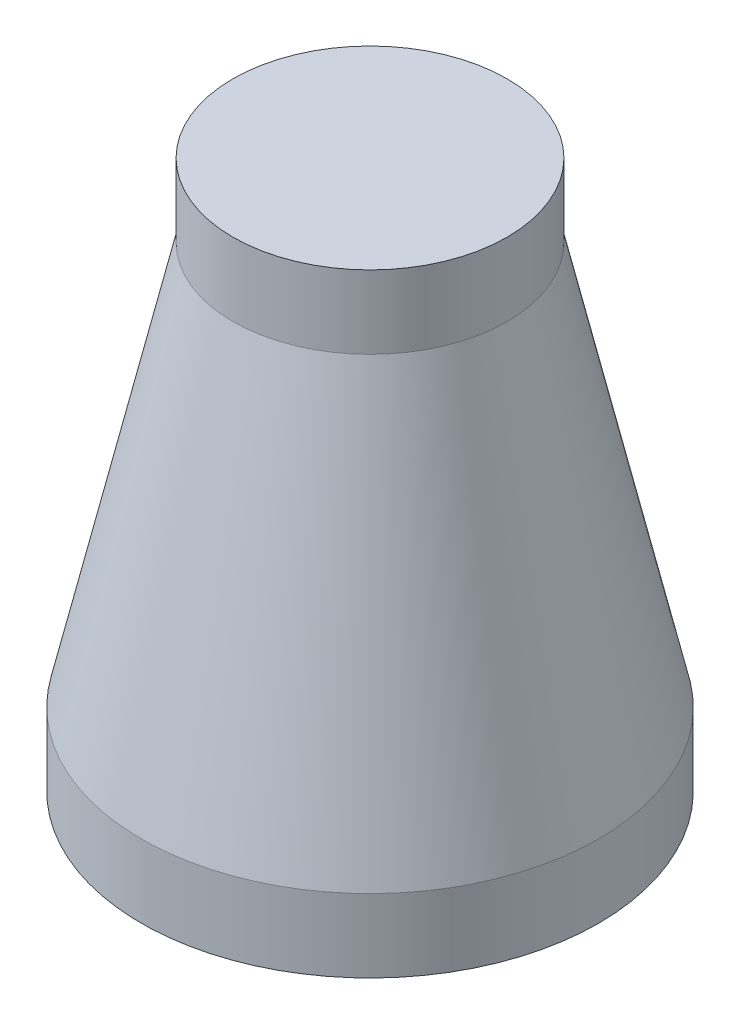
ISO-10303-21;
HEADER;
FILE_DESCRIPTION(('STEP AP214'),'2;1');
FILE_NAME('part.step','',(''),(''),'','','');
FILE_SCHEMA(('AUTOMOTIVE_DESIGN { 1 0 10303 214 1 1 1 1 }'));
ENDSEC;
DATA;
#1=APPLICATION_CONTEXT('core data for automotive mechanical design processes');
#2=APPLICATION_PROTOCOL_DEFINITION('international standard','automotive_design',2000,#1);
#3=PRODUCT_CONTEXT('',#1,'mechanical');
#4=PRODUCT('Part','Part','',(#3));
#5=PRODUCT_RELATED_PRODUCT_CATEGORY('part','',(#4));
#6=PRODUCT_DEFINITION_FORMATION('','',#4);
#7=PRODUCT_DEFINITION_CONTEXT('part definition',#1,'design');
#8=PRODUCT_DEFINITION('design','',#6,#7);
#9=PRODUCT_DEFINITION_SHAPE('','',#8);
#10=(LENGTH_UNIT() NAMED_UNIT(*) SI_UNIT(.MILLI.,.METRE.));
#11=(NAMED_UNIT(*) PLANE_ANGLE_UNIT() SI_UNIT($,.RADIAN.));
#12=(NAMED_UNIT(*) SI_UNIT($,.STERADIAN.) SOLID_ANGLE_UNIT());
#13=UNCERTAINTY_MEASURE_WITH_UNIT(LENGTH_MEASURE(1.E-05),#10,'distance_accuracy_value','');
#14=(GEOMETRIC_REPRESENTATION_CONTEXT(3) GLOBAL_UNCERTAINTY_ASSIGNED_CONTEXT((#13)) GLOBAL_UNIT_ASSIGNED_CONTEXT((#10,
#11,#12)) REPRESENTATION_CONTEXT('',''));
#15=CARTESIAN_POINT('',(0.,0.,0.));
#16=DIRECTION('',(0.,0.,1.));
#17=DIRECTION('',(1.,0.,0.));
#18=AXIS2_PLACEMENT_3D('',#15,#16,#17);
#19=CARTESIAN_POINT('',(0.,0.,0.));
#20=DIRECTION('',(0.,-1.,0.));
#21=DIRECTION('',(1.,0.,0.));
#22=AXIS2_PLACEMENT_3D('',#19,#20,#21);
#23=PLANE('',#22);
#24=CARTESIAN_POINT('',(0.,0.,0.));
#25=DIRECTION('',(0.,1.,0.));
#26=DIRECTION('',(-1.,0.,0.));
#27=AXIS2_PLACEMENT_3D('',#24,#25,#26);
#28=CIRCLE('',#27,15.);
#29=CARTESIAN_POINT('',(-15.,0.,0.));
#30=VERTEX_POINT('',#29);
#31=EDGE_CURVE('E52',#30,#30,#28,.T.);
#32=ORIENTED_EDGE('',*,*,#31,.T.);
#33=EDGE_LOOP('',(#32));
#34=FACE_BOUND('',#33,.T.);
#35=ADVANCED_FACE('F39',(#34),#23,.F.);
#36=CARTESIAN_POINT('',(0.,-60.,0.));
#37=DIRECTION('',(0.,1.,0.));
#38=DIRECTION('',(-1.,0.,0.));
#39=AXIS2_PLACEMENT_3D('',#36,#37,#38);
#40=PLANE('',#39);
#41=CARTESIAN_POINT('',(0.,-60.,0.));
#42=DIRECTION('',(0.,1.,0.));
#43=DIRECTION('',(-1.,0.,0.));
#44=AXIS2_PLACEMENT_3D('',#41,#42,#43);
#45=CIRCLE('',#44,25.);
#46=CARTESIAN_POINT('',(-25.,-60.,0.));
#47=VERTEX_POINT('',#46);
#48=EDGE_CURVE('E10',#47,#47,#45,.T.);
#49=ORIENTED_EDGE('',*,*,#48,.F.);
#50=EDGE_LOOP('',(#49));
#51=FACE_BOUND('',#50,.T.);
#52=ADVANCED_FACE('F73',(#51),#40,.F.);
#53=CARTESIAN_POINT('',(0.,-8.,0.));
#54=DIRECTION('',(0.,1.,0.));
#55=DIRECTION('',(-1.,0.,0.));
#56=AXIS2_PLACEMENT_3D('',#53,#54,#55);
#57=CYLINDRICAL_SURFACE('',#56,25.);
#58=CARTESIAN_POINT('',(0.,-52.,0.));
#59=DIRECTION('',(0.,1.,0.));
#60=DIRECTION('',(-1.,0.,0.));
#61=AXIS2_PLACEMENT_3D('',#58,#59,#60);
#62=CIRCLE('',#61,25.);
#63=CARTESIAN_POINT('',(-25.,-52.,0.));
#64=VERTEX_POINT('',#63);
#65=EDGE_CURVE('E44',#64,#64,#62,.T.);
#66=ORIENTED_EDGE('',*,*,#65,.F.);
#67=EDGE_LOOP('',(#66));
#68=FACE_BOUND('',#67,.T.);
#69=ORIENTED_EDGE('',*,*,#48,.T.);
#70=EDGE_LOOP('',(#69));
#71=FACE_BOUND('',#70,.T.);
#72=ADVANCED_FACE('F67',(#68,#71),#57,.T.);
#73=CARTESIAN_POINT('',(0.,-52.,0.));
#74=DIRECTION('',(0.,-1.,0.));
#75=DIRECTION('',(1.,0.,0.));
#76=AXIS2_PLACEMENT_3D('',#73,#74,#75);
#77=CONICAL_SURFACE('',#76,25.,0.223476601140633);
#78=CARTESIAN_POINT('',(0.,-8.,0.));
#79=DIRECTION('',(0.,1.,0.));
#80=DIRECTION('',(-1.,0.,0.));
#81=AXIS2_PLACEMENT_3D('',#78,#79,#80);
#82=CIRCLE('',#81,15.);
#83=CARTESIAN_POINT('',(-15.,-8.,0.));
#84=VERTEX_POINT('',#83);
#85=EDGE_CURVE('E47',#84,#84,#82,.T.);
#86=ORIENTED_EDGE('',*,*,#85,.F.);
#87=EDGE_LOOP('',(#86));
#88=FACE_BOUND('',#87,.T.);
#89=ORIENTED_EDGE('',*,*,#65,.T.);
#90=EDGE_LOOP('',(#89));
#91=FACE_BOUND('',#90,.T.);
#92=ADVANCED_FACE('F62',(#88,#91),#77,.T.);
#93=CARTESIAN_POINT('',(0.,-8.,0.));
#94=DIRECTION('',(0.,1.,0.));
#95=DIRECTION('',(-1.,0.,0.));
#96=AXIS2_PLACEMENT_3D('',#93,#94,#95);
#97=CYLINDRICAL_SURFACE('',#96,15.);
#98=ORIENTED_EDGE('',*,*,#31,.F.);
#99=EDGE_LOOP('',(#98));
#100=FACE_BOUND('',#99,.T.);
#101=ORIENTED_EDGE('',*,*,#85,.T.);
#102=EDGE_LOOP('',(#101));
#103=FACE_BOUND('',#102,.T.);
#104=ADVANCED_FACE('F58',(#100,#103),#97,.T.);
#105=CLOSED_SHELL('',(#35,#52,#72,#92,#104));
#106=MANIFOLD_SOLID_BREP('B2',#105);
#107=ADVANCED_BREP_SHAPE_REPRESENTATION('',(#18,#106),#14);
#108=SHAPE_DEFINITION_REPRESENTATION(#9,#107);
ENDSEC;
END-ISO-10303-21;
